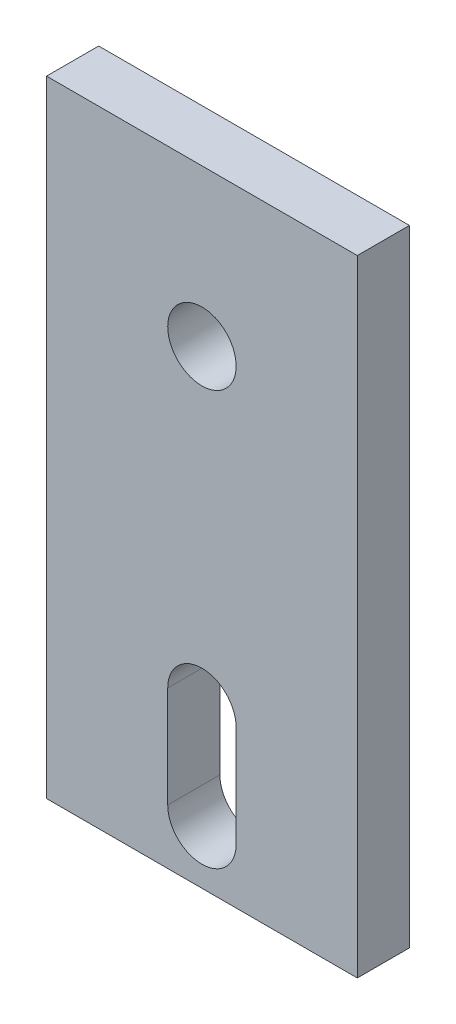
ISO-10303-21;
HEADER;
FILE_DESCRIPTION(('STEP AP214'),'2;1');
FILE_NAME('part.step','',(''),(''),'','','');
FILE_SCHEMA(('AUTOMOTIVE_DESIGN { 1 0 10303 214 1 1 1 1 }'));
ENDSEC;
DATA;
#1=APPLICATION_CONTEXT('core data for automotive mechanical design processes');
#2=APPLICATION_PROTOCOL_DEFINITION('international standard','automotive_design',2000,#1);
#3=PRODUCT_CONTEXT('',#1,'mechanical');
#4=PRODUCT('Part','Part','',(#3));
#5=PRODUCT_RELATED_PRODUCT_CATEGORY('part','',(#4));
#6=PRODUCT_DEFINITION_FORMATION('','',#4);
#7=PRODUCT_DEFINITION_CONTEXT('part definition',#1,'design');
#8=PRODUCT_DEFINITION('design','',#6,#7);
#9=PRODUCT_DEFINITION_SHAPE('','',#8);
#10=(LENGTH_UNIT() NAMED_UNIT(*) SI_UNIT(.MILLI.,.METRE.));
#11=(NAMED_UNIT(*) PLANE_ANGLE_UNIT() SI_UNIT($,.RADIAN.));
#12=(NAMED_UNIT(*) SI_UNIT($,.STERADIAN.) SOLID_ANGLE_UNIT());
#13=UNCERTAINTY_MEASURE_WITH_UNIT(LENGTH_MEASURE(1.E-05),#10,'distance_accuracy_value','');
#14=(GEOMETRIC_REPRESENTATION_CONTEXT(3) GLOBAL_UNCERTAINTY_ASSIGNED_CONTEXT((#13)) GLOBAL_UNIT_ASSIGNED_CONTEXT((#10,
#11,#12)) REPRESENTATION_CONTEXT('',''));
#15=CARTESIAN_POINT('',(0.,0.,0.));
#16=DIRECTION('',(0.,0.,1.));
#17=DIRECTION('',(1.,0.,0.));
#18=AXIS2_PLACEMENT_3D('',#15,#16,#17);
#19=CARTESIAN_POINT('',(18.923,0.,0.));
#20=DIRECTION('',(1.,0.,0.));
#21=DIRECTION('',(0.,0.,-1.));
#22=AXIS2_PLACEMENT_3D('',#19,#20,#21);
#23=PLANE('',#22);
#24=DIRECTION('',(0.,1.,0.));
#25=VECTOR('',#24,1.);
#26=CARTESIAN_POINT('',(18.923,0.,6.35));
#27=LINE('',#26,#25);
#28=CARTESIAN_POINT('',(18.923,0.,6.35));
#29=VERTEX_POINT('',#28);
#30=CARTESIAN_POINT('',(18.923,76.2,6.35));
#31=VERTEX_POINT('',#30);
#32=EDGE_CURVE('E147',#29,#31,#27,.T.);
#33=ORIENTED_EDGE('',*,*,#32,.F.);
#34=DIRECTION('',(0.,0.,1.));
#35=VECTOR('',#34,1.);
#36=CARTESIAN_POINT('',(18.923,0.,0.));
#37=LINE('',#36,#35);
#38=CARTESIAN_POINT('',(18.923,0.,0.));
#39=VERTEX_POINT('',#38);
#40=EDGE_CURVE('E11',#39,#29,#37,.T.);
#41=ORIENTED_EDGE('',*,*,#40,.F.);
#42=DIRECTION('',(0.,1.,0.));
#43=VECTOR('',#42,1.);
#44=CARTESIAN_POINT('',(18.923,0.,0.));
#45=LINE('',#44,#43);
#46=CARTESIAN_POINT('',(18.923,76.2,0.));
#47=VERTEX_POINT('',#46);
#48=EDGE_CURVE('E150',#39,#47,#45,.T.);
#49=ORIENTED_EDGE('',*,*,#48,.T.);
#50=DIRECTION('',(0.,0.,1.));
#51=VECTOR('',#50,1.);
#52=CARTESIAN_POINT('',(18.923,76.2,0.));
#53=LINE('',#52,#51);
#54=EDGE_CURVE('E36',#47,#31,#53,.T.);
#55=ORIENTED_EDGE('',*,*,#54,.T.);
#56=EDGE_LOOP('',(#33,#41,#49,#55));
#57=FACE_BOUND('',#56,.T.);
#58=ADVANCED_FACE('F33',(#57),#23,.T.);
#59=CARTESIAN_POINT('',(-18.923,0.,0.));
#60=DIRECTION('',(0.,-1.,0.));
#61=DIRECTION('',(1.,0.,0.));
#62=AXIS2_PLACEMENT_3D('',#59,#60,#61);
#63=PLANE('',#62);
#64=DIRECTION('',(1.,0.,0.));
#65=VECTOR('',#64,1.);
#66=CARTESIAN_POINT('',(-18.923,0.,6.35));
#67=LINE('',#66,#65);
#68=CARTESIAN_POINT('',(-18.923,0.,6.35));
#69=VERTEX_POINT('',#68);
#70=EDGE_CURVE('E153',#69,#29,#67,.T.);
#71=ORIENTED_EDGE('',*,*,#70,.F.);
#72=DIRECTION('',(0.,0.,1.));
#73=VECTOR('',#72,1.);
#74=CARTESIAN_POINT('',(-18.923,0.,0.));
#75=LINE('',#74,#73);
#76=CARTESIAN_POINT('',(-18.923,0.,0.));
#77=VERTEX_POINT('',#76);
#78=EDGE_CURVE('E41',#77,#69,#75,.T.);
#79=ORIENTED_EDGE('',*,*,#78,.F.);
#80=DIRECTION('',(1.,0.,0.));
#81=VECTOR('',#80,1.);
#82=CARTESIAN_POINT('',(-18.923,0.,0.));
#83=LINE('',#82,#81);
#84=EDGE_CURVE('E158',#77,#39,#83,.T.);
#85=ORIENTED_EDGE('',*,*,#84,.T.);
#86=ORIENTED_EDGE('',*,*,#40,.T.);
#87=EDGE_LOOP('',(#71,#79,#85,#86));
#88=FACE_BOUND('',#87,.T.);
#89=ADVANCED_FACE('F175',(#88),#63,.T.);
#90=CARTESIAN_POINT('',(-18.923,76.2,0.));
#91=DIRECTION('',(-1.,0.,0.));
#92=DIRECTION('',(0.,0.,1.));
#93=AXIS2_PLACEMENT_3D('',#90,#91,#92);
#94=PLANE('',#93);
#95=DIRECTION('',(0.,-1.,0.));
#96=VECTOR('',#95,1.);
#97=CARTESIAN_POINT('',(-18.923,76.2,6.35));
#98=LINE('',#97,#96);
#99=CARTESIAN_POINT('',(-18.923,76.2,6.35));
#100=VERTEX_POINT('',#99);
#101=EDGE_CURVE('E165',#100,#69,#98,.T.);
#102=ORIENTED_EDGE('',*,*,#101,.F.);
#103=DIRECTION('',(0.,0.,1.));
#104=VECTOR('',#103,1.);
#105=CARTESIAN_POINT('',(-18.923,76.2,0.));
#106=LINE('',#105,#104);
#107=CARTESIAN_POINT('',(-18.923,76.2,0.));
#108=VERTEX_POINT('',#107);
#109=EDGE_CURVE('E170',#108,#100,#106,.T.);
#110=ORIENTED_EDGE('',*,*,#109,.F.);
#111=DIRECTION('',(0.,-1.,0.));
#112=VECTOR('',#111,1.);
#113=CARTESIAN_POINT('',(-18.923,76.2,0.));
#114=LINE('',#113,#112);
#115=EDGE_CURVE('E155',#108,#77,#114,.T.);
#116=ORIENTED_EDGE('',*,*,#115,.T.);
#117=ORIENTED_EDGE('',*,*,#78,.T.);
#118=EDGE_LOOP('',(#102,#110,#116,#117));
#119=FACE_BOUND('',#118,.T.);
#120=ADVANCED_FACE('F179',(#119),#94,.T.);
#121=CARTESIAN_POINT('',(18.923,76.2,0.));
#122=DIRECTION('',(0.,1.,0.));
#123=DIRECTION('',(0.,0.,1.));
#124=AXIS2_PLACEMENT_3D('',#121,#122,#123);
#125=PLANE('',#124);
#126=DIRECTION('',(-1.,0.,0.));
#127=VECTOR('',#126,1.);
#128=CARTESIAN_POINT('',(18.923,76.2,6.35));
#129=LINE('',#128,#127);
#130=EDGE_CURVE('E162',#31,#100,#129,.T.);
#131=ORIENTED_EDGE('',*,*,#130,.F.);
#132=ORIENTED_EDGE('',*,*,#54,.F.);
#133=DIRECTION('',(-1.,0.,0.));
#134=VECTOR('',#133,1.);
#135=CARTESIAN_POINT('',(18.923,76.2,0.));
#136=LINE('',#135,#134);
#137=EDGE_CURVE('E152',#47,#108,#136,.T.);
#138=ORIENTED_EDGE('',*,*,#137,.T.);
#139=ORIENTED_EDGE('',*,*,#109,.T.);
#140=EDGE_LOOP('',(#131,#132,#138,#139));
#141=FACE_BOUND('',#140,.T.);
#142=ADVANCED_FACE('F172',(#141),#125,.T.);
#143=CARTESIAN_POINT('',(0.,0.,0.));
#144=DIRECTION('',(0.,0.,1.));
#145=DIRECTION('',(1.,0.,0.));
#146=AXIS2_PLACEMENT_3D('',#143,#144,#145);
#147=PLANE('',#146);
#148=CARTESIAN_POINT('',(0.,19.05,0.));
#149=DIRECTION('',(0.,0.,1.));
#150=DIRECTION('',(-1.,0.,0.));
#151=AXIS2_PLACEMENT_3D('',#148,#149,#150);
#152=CIRCLE('',#151,4.1656);
#153=CARTESIAN_POINT('',(4.1656,19.05,0.));
#154=VERTEX_POINT('',#153);
#155=CARTESIAN_POINT('',(-4.1656,19.05,0.));
#156=VERTEX_POINT('',#155);
#157=EDGE_CURVE('E139',#154,#156,#152,.T.);
#158=ORIENTED_EDGE('',*,*,#157,.T.);
#159=DIRECTION('',(0.,-1.,0.));
#160=VECTOR('',#159,1.);
#161=CARTESIAN_POINT('',(-4.1656,6.7056,0.));
#162=LINE('',#161,#160);
#163=CARTESIAN_POINT('',(-4.1656,6.7056,0.));
#164=VERTEX_POINT('',#163);
#165=EDGE_CURVE('E114',#156,#164,#162,.T.);
#166=ORIENTED_EDGE('',*,*,#165,.T.);
#167=CARTESIAN_POINT('',(0.,6.7056,0.));
#168=DIRECTION('',(0.,0.,1.));
#169=DIRECTION('',(1.,0.,0.));
#170=AXIS2_PLACEMENT_3D('',#167,#168,#169);
#171=CIRCLE('',#170,4.1656);
#172=CARTESIAN_POINT('',(4.1656,6.7056,0.));
#173=VERTEX_POINT('',#172);
#174=EDGE_CURVE('E109',#164,#173,#171,.T.);
#175=ORIENTED_EDGE('',*,*,#174,.T.);
#176=DIRECTION('',(0.,1.,0.));
#177=VECTOR('',#176,1.);
#178=CARTESIAN_POINT('',(4.1656,6.7056,0.));
#179=LINE('',#178,#177);
#180=EDGE_CURVE('E117',#173,#154,#179,.T.);
#181=ORIENTED_EDGE('',*,*,#180,.T.);
#182=EDGE_LOOP('',(#158,#166,#175,#181));
#183=FACE_BOUND('',#182,.T.);
#184=CARTESIAN_POINT('',(0.,57.15,0.));
#185=DIRECTION('',(0.,0.,1.));
#186=DIRECTION('',(-1.,0.,0.));
#187=AXIS2_PLACEMENT_3D('',#184,#185,#186);
#188=CIRCLE('',#187,4.1656);
#189=CARTESIAN_POINT('',(-4.1656,57.15,0.));
#190=VERTEX_POINT('',#189);
#191=EDGE_CURVE('E144',#190,#190,#188,.T.);
#192=ORIENTED_EDGE('',*,*,#191,.T.);
#193=EDGE_LOOP('',(#192));
#194=FACE_BOUND('',#193,.T.);
#195=ORIENTED_EDGE('',*,*,#48,.F.);
#196=ORIENTED_EDGE('',*,*,#84,.F.);
#197=ORIENTED_EDGE('',*,*,#115,.F.);
#198=ORIENTED_EDGE('',*,*,#137,.F.);
#199=EDGE_LOOP('',(#195,#196,#197,#198));
#200=FACE_BOUND('',#199,.T.);
#201=ADVANCED_FACE('F123',(#183,#194,#200),#147,.F.);
#202=CARTESIAN_POINT('',(0.,0.,6.35));
#203=DIRECTION('',(0.,0.,1.));
#204=DIRECTION('',(1.,0.,0.));
#205=AXIS2_PLACEMENT_3D('',#202,#203,#204);
#206=PLANE('',#205);
#207=DIRECTION('',(0.,-1.,0.));
#208=VECTOR('',#207,1.);
#209=CARTESIAN_POINT('',(-4.1656,6.7056,6.35));
#210=LINE('',#209,#208);
#211=CARTESIAN_POINT('',(-4.1656,19.05,6.35));
#212=VERTEX_POINT('',#211);
#213=CARTESIAN_POINT('',(-4.1656,6.7056,6.35));
#214=VERTEX_POINT('',#213);
#215=EDGE_CURVE('E125',#212,#214,#210,.T.);
#216=ORIENTED_EDGE('',*,*,#215,.F.);
#217=CARTESIAN_POINT('',(0.,19.05,6.35));
#218=DIRECTION('',(0.,0.,1.));
#219=DIRECTION('',(-1.,0.,0.));
#220=AXIS2_PLACEMENT_3D('',#217,#218,#219);
#221=CIRCLE('',#220,4.1656);
#222=CARTESIAN_POINT('',(4.1656,19.05,6.35));
#223=VERTEX_POINT('',#222);
#224=EDGE_CURVE('E135',#223,#212,#221,.T.);
#225=ORIENTED_EDGE('',*,*,#224,.F.);
#226=DIRECTION('',(0.,1.,0.));
#227=VECTOR('',#226,1.);
#228=CARTESIAN_POINT('',(4.1656,6.7056,6.35));
#229=LINE('',#228,#227);
#230=CARTESIAN_POINT('',(4.1656,6.7056,6.35));
#231=VERTEX_POINT('',#230);
#232=EDGE_CURVE('E49',#231,#223,#229,.T.);
#233=ORIENTED_EDGE('',*,*,#232,.F.);
#234=CARTESIAN_POINT('',(0.,6.7056,6.35));
#235=DIRECTION('',(0.,0.,1.));
#236=DIRECTION('',(1.,0.,0.));
#237=AXIS2_PLACEMENT_3D('',#234,#235,#236);
#238=CIRCLE('',#237,4.1656);
#239=EDGE_CURVE('E112',#214,#231,#238,.T.);
#240=ORIENTED_EDGE('',*,*,#239,.F.);
#241=EDGE_LOOP('',(#216,#225,#233,#240));
#242=FACE_BOUND('',#241,.T.);
#243=CARTESIAN_POINT('',(0.,57.15,6.35));
#244=DIRECTION('',(0.,0.,1.));
#245=DIRECTION('',(-1.,0.,0.));
#246=AXIS2_PLACEMENT_3D('',#243,#244,#245);
#247=CIRCLE('',#246,4.1656);
#248=CARTESIAN_POINT('',(-4.1656,57.15,6.35));
#249=VERTEX_POINT('',#248);
#250=EDGE_CURVE('E141',#249,#249,#247,.T.);
#251=ORIENTED_EDGE('',*,*,#250,.F.);
#252=EDGE_LOOP('',(#251));
#253=FACE_BOUND('',#252,.T.);
#254=ORIENTED_EDGE('',*,*,#32,.T.);
#255=ORIENTED_EDGE('',*,*,#130,.T.);
#256=ORIENTED_EDGE('',*,*,#101,.T.);
#257=ORIENTED_EDGE('',*,*,#70,.T.);
#258=EDGE_LOOP('',(#254,#255,#256,#257));
#259=FACE_BOUND('',#258,.T.);
#260=ADVANCED_FACE('F174',(#242,#253,#259),#206,.T.);
#261=CARTESIAN_POINT('',(0.,57.15,0.));
#262=DIRECTION('',(0.,0.,1.));
#263=DIRECTION('',(1.,0.,0.));
#264=AXIS2_PLACEMENT_3D('',#261,#262,#263);
#265=CYLINDRICAL_SURFACE('',#264,4.1656);
#266=ORIENTED_EDGE('',*,*,#191,.F.);
#267=EDGE_LOOP('',(#266));
#268=FACE_BOUND('',#267,.T.);
#269=ORIENTED_EDGE('',*,*,#250,.T.);
#270=EDGE_LOOP('',(#269));
#271=FACE_BOUND('',#270,.T.);
#272=ADVANCED_FACE('F187',(#268,#271),#265,.F.);
#273=CARTESIAN_POINT('',(0.,19.05,0.));
#274=DIRECTION('',(0.,0.,1.));
#275=DIRECTION('',(1.,0.,0.));
#276=AXIS2_PLACEMENT_3D('',#273,#274,#275);
#277=CYLINDRICAL_SURFACE('',#276,4.1656);
#278=ORIENTED_EDGE('',*,*,#224,.T.);
#279=DIRECTION('',(0.,0.,1.));
#280=VECTOR('',#279,1.);
#281=CARTESIAN_POINT('',(-4.1656,19.05,0.));
#282=LINE('',#281,#280);
#283=EDGE_CURVE('E136',#156,#212,#282,.T.);
#284=ORIENTED_EDGE('',*,*,#283,.F.);
#285=ORIENTED_EDGE('',*,*,#157,.F.);
#286=DIRECTION('',(0.,0.,1.));
#287=VECTOR('',#286,1.);
#288=CARTESIAN_POINT('',(4.1656,19.05,0.));
#289=LINE('',#288,#287);
#290=EDGE_CURVE('E113',#154,#223,#289,.T.);
#291=ORIENTED_EDGE('',*,*,#290,.T.);
#292=EDGE_LOOP('',(#278,#284,#285,#291));
#293=FACE_BOUND('',#292,.T.);
#294=ADVANCED_FACE('F224',(#293),#277,.F.);
#295=CARTESIAN_POINT('',(0.,6.7056,0.));
#296=DIRECTION('',(0.,0.,1.));
#297=DIRECTION('',(1.,0.,0.));
#298=AXIS2_PLACEMENT_3D('',#295,#296,#297);
#299=CYLINDRICAL_SURFACE('',#298,4.1656);
#300=ORIENTED_EDGE('',*,*,#239,.T.);
#301=DIRECTION('',(0.,0.,1.));
#302=VECTOR('',#301,1.);
#303=CARTESIAN_POINT('',(4.1656,6.7056,0.));
#304=LINE('',#303,#302);
#305=EDGE_CURVE('E105',#173,#231,#304,.T.);
#306=ORIENTED_EDGE('',*,*,#305,.F.);
#307=ORIENTED_EDGE('',*,*,#174,.F.);
#308=DIRECTION('',(0.,0.,1.));
#309=VECTOR('',#308,1.);
#310=CARTESIAN_POINT('',(-4.1656,6.7056,0.));
#311=LINE('',#310,#309);
#312=EDGE_CURVE('E133',#164,#214,#311,.T.);
#313=ORIENTED_EDGE('',*,*,#312,.T.);
#314=EDGE_LOOP('',(#300,#306,#307,#313));
#315=FACE_BOUND('',#314,.T.);
#316=ADVANCED_FACE('F107',(#315),#299,.F.);
#317=CARTESIAN_POINT('',(-4.1656,6.7056,0.));
#318=DIRECTION('',(-1.,0.,0.));
#319=DIRECTION('',(0.,0.,1.));
#320=AXIS2_PLACEMENT_3D('',#317,#318,#319);
#321=PLANE('',#320);
#322=ORIENTED_EDGE('',*,*,#215,.T.);
#323=ORIENTED_EDGE('',*,*,#312,.F.);
#324=ORIENTED_EDGE('',*,*,#165,.F.);
#325=ORIENTED_EDGE('',*,*,#283,.T.);
#326=EDGE_LOOP('',(#322,#323,#324,#325));
#327=FACE_BOUND('',#326,.T.);
#328=ADVANCED_FACE('F239',(#327),#321,.F.);
#329=CARTESIAN_POINT('',(4.1656,6.7056,0.));
#330=DIRECTION('',(1.,0.,0.));
#331=DIRECTION('',(0.,0.,-1.));
#332=AXIS2_PLACEMENT_3D('',#329,#330,#331);
#333=PLANE('',#332);
#334=ORIENTED_EDGE('',*,*,#232,.T.);
#335=ORIENTED_EDGE('',*,*,#290,.F.);
#336=ORIENTED_EDGE('',*,*,#180,.F.);
#337=ORIENTED_EDGE('',*,*,#305,.T.);
#338=EDGE_LOOP('',(#334,#335,#336,#337));
#339=FACE_BOUND('',#338,.T.);
#340=ADVANCED_FACE('F118',(#339),#333,.F.);
#341=CLOSED_SHELL('',(#58,#89,#120,#142,#201,#260,#272,#294,#316,#328,#340));
#342=MANIFOLD_SOLID_BREP('B2',#341);
#343=ADVANCED_BREP_SHAPE_REPRESENTATION('',(#18,#342),#14);
#344=SHAPE_DEFINITION_REPRESENTATION(#9,#343);
ENDSEC;
END-ISO-10303-21;
